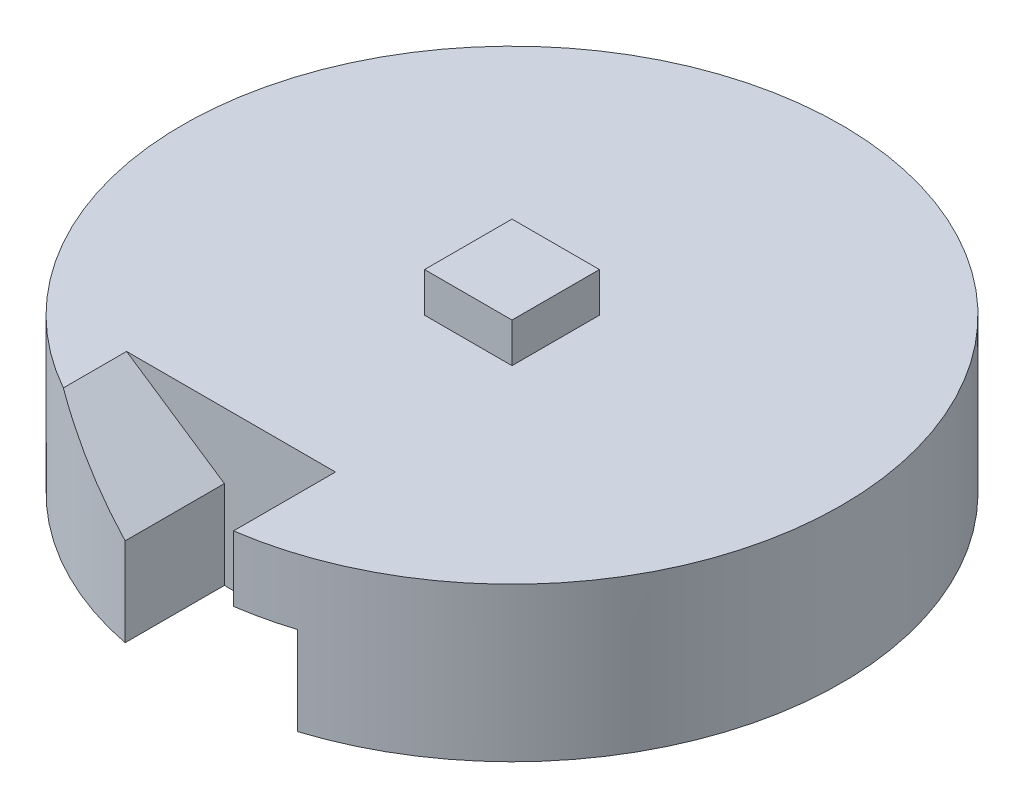
ISO-10303-21;
HEADER;
FILE_DESCRIPTION(('STEP AP214'),'2;1');
FILE_NAME('part.step','',(''),(''),'','','');
FILE_SCHEMA(('AUTOMOTIVE_DESIGN { 1 0 10303 214 1 1 1 1 }'));
ENDSEC;
DATA;
#1=APPLICATION_CONTEXT('core data for automotive mechanical design processes');
#2=APPLICATION_PROTOCOL_DEFINITION('international standard','automotive_design',2000,#1);
#3=PRODUCT_CONTEXT('',#1,'mechanical');
#4=PRODUCT('Part','Part','',(#3));
#5=PRODUCT_RELATED_PRODUCT_CATEGORY('part','',(#4));
#6=PRODUCT_DEFINITION_FORMATION('','',#4);
#7=PRODUCT_DEFINITION_CONTEXT('part definition',#1,'design');
#8=PRODUCT_DEFINITION('design','',#6,#7);
#9=PRODUCT_DEFINITION_SHAPE('','',#8);
#10=(LENGTH_UNIT() NAMED_UNIT(*) SI_UNIT(.MILLI.,.METRE.));
#11=(NAMED_UNIT(*) PLANE_ANGLE_UNIT() SI_UNIT($,.RADIAN.));
#12=(NAMED_UNIT(*) SI_UNIT($,.STERADIAN.) SOLID_ANGLE_UNIT());
#13=UNCERTAINTY_MEASURE_WITH_UNIT(LENGTH_MEASURE(1.E-05),#10,'distance_accuracy_value','');
#14=(GEOMETRIC_REPRESENTATION_CONTEXT(3) GLOBAL_UNCERTAINTY_ASSIGNED_CONTEXT((#13)) GLOBAL_UNIT_ASSIGNED_CONTEXT((#10,
#11,#12)) REPRESENTATION_CONTEXT('',''));
#15=CARTESIAN_POINT('',(0.,0.,0.));
#16=DIRECTION('',(0.,0.,1.));
#17=DIRECTION('',(1.,0.,0.));
#18=AXIS2_PLACEMENT_3D('',#15,#16,#17);
#19=CARTESIAN_POINT('',(0.,17.5,0.));
#20=DIRECTION('',(0.,1.,0.));
#21=DIRECTION('',(0.,0.,1.));
#22=AXIS2_PLACEMENT_3D('',#19,#20,#21);
#23=PLANE('',#22);
#24=DIRECTION('',(0.,0.,-1.));
#25=VECTOR('',#24,1.);
#26=CARTESIAN_POINT('',(5.40916797594821,17.5,0.));
#27=LINE('',#26,#25);
#28=CARTESIAN_POINT('',(5.40916797594821,17.5,37.1078280394848));
#29=VERTEX_POINT('',#28);
#30=CARTESIAN_POINT('',(5.40916797594821,17.5,25.5));
#31=VERTEX_POINT('',#30);
#32=EDGE_CURVE('E326',#29,#31,#27,.T.);
#33=ORIENTED_EDGE('',*,*,#32,.F.);
#34=CARTESIAN_POINT('',(0.,17.5,0.));
#35=DIRECTION('',(0.,1.,0.));
#36=DIRECTION('',(0.,0.,1.));
#37=AXIS2_PLACEMENT_3D('',#34,#35,#36);
#38=CIRCLE('',#37,37.5);
#39=CARTESIAN_POINT('',(-18.3618136354973,17.5,32.6969998626061));
#40=VERTEX_POINT('',#39);
#41=EDGE_CURVE('E305',#29,#40,#38,.T.);
#42=ORIENTED_EDGE('',*,*,#41,.T.);
#43=DIRECTION('',(0.,0.,1.));
#44=VECTOR('',#43,1.);
#45=CARTESIAN_POINT('',(-18.3618136354973,17.5,0.));
#46=LINE('',#45,#44);
#47=CARTESIAN_POINT('',(-18.3618136354973,17.5,25.5));
#48=VERTEX_POINT('',#47);
#49=EDGE_CURVE('E323',#48,#40,#46,.T.);
#50=ORIENTED_EDGE('',*,*,#49,.F.);
#51=DIRECTION('',(1.,0.,0.));
#52=VECTOR('',#51,1.);
#53=CARTESIAN_POINT('',(0.,17.5,25.5));
#54=LINE('',#53,#52);
#55=EDGE_CURVE('E277',#48,#31,#54,.T.);
#56=ORIENTED_EDGE('',*,*,#55,.T.);
#57=EDGE_LOOP('',(#33,#42,#50,#56));
#58=FACE_BOUND('',#57,.T.);
#59=DIRECTION('',(1.,0.,0.));
#60=VECTOR('',#59,1.);
#61=CARTESIAN_POINT('',(0.,17.5,-4.975));
#62=LINE('',#61,#60);
#63=CARTESIAN_POINT('',(-4.975,17.5,-4.975));
#64=VERTEX_POINT('',#63);
#65=CARTESIAN_POINT('',(4.975,17.5,-4.975));
#66=VERTEX_POINT('',#65);
#67=EDGE_CURVE('E247',#64,#66,#62,.T.);
#68=ORIENTED_EDGE('',*,*,#67,.T.);
#69=DIRECTION('',(0.,0.,1.));
#70=VECTOR('',#69,1.);
#71=CARTESIAN_POINT('',(4.975,17.5,0.));
#72=LINE('',#71,#70);
#73=CARTESIAN_POINT('',(4.975,17.5,4.975));
#74=VERTEX_POINT('',#73);
#75=EDGE_CURVE('E251',#66,#74,#72,.T.);
#76=ORIENTED_EDGE('',*,*,#75,.T.);
#77=DIRECTION('',(-1.,0.,0.));
#78=VECTOR('',#77,1.);
#79=CARTESIAN_POINT('',(0.,17.5,4.975));
#80=LINE('',#79,#78);
#81=CARTESIAN_POINT('',(-4.975,17.5,4.975));
#82=VERTEX_POINT('',#81);
#83=EDGE_CURVE('E239',#74,#82,#80,.T.);
#84=ORIENTED_EDGE('',*,*,#83,.T.);
#85=DIRECTION('',(0.,0.,-1.));
#86=VECTOR('',#85,1.);
#87=CARTESIAN_POINT('',(-4.975,17.5,0.));
#88=LINE('',#87,#86);
#89=EDGE_CURVE('E243',#82,#64,#88,.T.);
#90=ORIENTED_EDGE('',*,*,#89,.T.);
#91=EDGE_LOOP('',(#68,#76,#84,#90));
#92=FACE_BOUND('',#91,.T.);
#93=ADVANCED_FACE('F45',(#58,#92),#23,.T.);
#94=CARTESIAN_POINT('',(0.,17.5,0.));
#95=DIRECTION('',(0.,-1.,0.));
#96=DIRECTION('',(0.,0.,-1.));
#97=AXIS2_PLACEMENT_3D('',#94,#95,#96);
#98=CYLINDRICAL_SURFACE('',#97,37.5);
#99=ORIENTED_EDGE('',*,*,#41,.F.);
#100=DIRECTION('',(0.,-1.,0.));
#101=VECTOR('',#100,1.);
#102=CARTESIAN_POINT('',(5.40916797594821,17.5,37.1078280394848));
#103=LINE('',#102,#101);
#104=CARTESIAN_POINT('',(5.40916797594821,10.0586939101936,37.1078280394848));
#105=VERTEX_POINT('',#104);
#106=EDGE_CURVE('E300',#29,#105,#103,.T.);
#107=ORIENTED_EDGE('',*,*,#106,.T.);
#108=CARTESIAN_POINT('',(0.,10.0586939101936,0.));
#109=DIRECTION('',(0.,1.,0.));
#110=DIRECTION('',(0.,0.,1.));
#111=AXIS2_PLACEMENT_3D('',#108,#109,#110);
#112=CIRCLE('',#111,37.5);
#113=CARTESIAN_POINT('',(11.3377548552186,10.0586939101936,35.7450040543146));
#114=VERTEX_POINT('',#113);
#115=EDGE_CURVE('E54',#105,#114,#112,.T.);
#116=ORIENTED_EDGE('',*,*,#115,.T.);
#117=DIRECTION('',(0.,-1.,0.));
#118=VECTOR('',#117,1.);
#119=CARTESIAN_POINT('',(11.3377548552186,17.5,35.7450040543146));
#120=LINE('',#119,#118);
#121=CARTESIAN_POINT('',(11.3377548552186,0.,35.7450040543146));
#122=VERTEX_POINT('',#121);
#123=EDGE_CURVE('E292',#114,#122,#120,.T.);
#124=ORIENTED_EDGE('',*,*,#123,.T.);
#125=CARTESIAN_POINT('',(0.,0.,0.));
#126=DIRECTION('',(0.,1.,0.));
#127=DIRECTION('',(0.,0.,1.));
#128=AXIS2_PLACEMENT_3D('',#125,#126,#127);
#129=CIRCLE('',#128,37.5);
#130=CARTESIAN_POINT('',(-7.23202995206033,0.,36.7960288994954));
#131=VERTEX_POINT('',#130);
#132=EDGE_CURVE('E304',#122,#131,#129,.T.);
#133=ORIENTED_EDGE('',*,*,#132,.T.);
#134=DIRECTION('',(0.,-1.,0.));
#135=VECTOR('',#134,1.);
#136=CARTESIAN_POINT('',(-7.23202995206033,17.5,36.7960288994954));
#137=LINE('',#136,#135);
#138=CARTESIAN_POINT('',(-7.23202995206033,10.0401319165543,36.7960288994954));
#139=VERTEX_POINT('',#138);
#140=EDGE_CURVE('E288',#131,#139,#137,.F.);
#141=ORIENTED_EDGE('',*,*,#140,.T.);
#142=CARTESIAN_POINT('',(0.,5.19277899825944,0.));
#143=DIRECTION('',(-0.556765929579434,-0.830669428629433,0.));
#144=DIRECTION('',(0.830669428629433,-0.556765929579434,0.));
#145=AXIS2_PLACEMENT_3D('',#142,#143,#144);
#146=ELLIPSE('',#145,45.1443121746677,37.5);
#147=EDGE_CURVE('E296',#139,#40,#146,.T.);
#148=ORIENTED_EDGE('',*,*,#147,.T.);
#149=EDGE_LOOP('',(#99,#107,#116,#124,#133,#141,#148));
#150=FACE_BOUND('',#149,.T.);
#151=ADVANCED_FACE('F47',(#150),#98,.T.);
#152=CARTESIAN_POINT('',(0.,0.,0.));
#153=DIRECTION('',(0.,1.,0.));
#154=DIRECTION('',(0.,0.,1.));
#155=AXIS2_PLACEMENT_3D('',#152,#153,#154);
#156=PLANE('',#155);
#157=CARTESIAN_POINT('',(30.0180115311504,0.,0.00676759727533624));
#158=DIRECTION('',(0.,-1.,0.));
#159=DIRECTION('',(0.,0.,-1.));
#160=AXIS2_PLACEMENT_3D('',#157,#158,#159);
#161=CIRCLE('',#160,3.025);
#162=CARTESIAN_POINT('',(30.0180115311504,0.,-3.01823240272466));
#163=VERTEX_POINT('',#162);
#164=EDGE_CURVE('E412',#163,#163,#161,.T.);
#165=ORIENTED_EDGE('',*,*,#164,.F.);
#166=EDGE_LOOP('',(#165));
#167=FACE_BOUND('',#166,.T.);
#168=CARTESIAN_POINT('',(-29.9819884688496,0.,0.00676759727533257));
#169=DIRECTION('',(0.,-1.,0.));
#170=DIRECTION('',(0.,0.,-1.));
#171=AXIS2_PLACEMENT_3D('',#168,#169,#170);
#172=CIRCLE('',#171,3.025);
#173=CARTESIAN_POINT('',(-29.9819884688496,0.,-3.01823240272467));
#174=VERTEX_POINT('',#173);
#175=EDGE_CURVE('E416',#174,#174,#172,.T.);
#176=ORIENTED_EDGE('',*,*,#175,.F.);
#177=EDGE_LOOP('',(#176));
#178=FACE_BOUND('',#177,.T.);
#179=CARTESIAN_POINT('',(0.,0.,0.));
#180=DIRECTION('',(0.,1.,0.));
#181=DIRECTION('',(0.,0.,1.));
#182=AXIS2_PLACEMENT_3D('',#179,#180,#181);
#183=CIRCLE('',#182,5.);
#184=CARTESIAN_POINT('',(0.,0.,5.));
#185=VERTEX_POINT('',#184);
#186=EDGE_CURVE('E11',#185,#185,#183,.F.);
#187=ORIENTED_EDGE('',*,*,#186,.F.);
#188=EDGE_LOOP('',(#187));
#189=FACE_BOUND('',#188,.T.);
#190=ORIENTED_EDGE('',*,*,#132,.F.);
#191=DIRECTION('',(0.,0.,-1.));
#192=VECTOR('',#191,1.);
#193=CARTESIAN_POINT('',(11.3377548552186,0.,0.));
#194=LINE('',#193,#192);
#195=CARTESIAN_POINT('',(11.3377548552186,0.,25.5));
#196=VERTEX_POINT('',#195);
#197=EDGE_CURVE('E319',#122,#196,#194,.T.);
#198=ORIENTED_EDGE('',*,*,#197,.T.);
#199=DIRECTION('',(1.,0.,0.));
#200=VECTOR('',#199,1.);
#201=CARTESIAN_POINT('',(0.,0.,25.5));
#202=LINE('',#201,#200);
#203=CARTESIAN_POINT('',(-7.23202995206033,0.,25.5));
#204=VERTEX_POINT('',#203);
#205=EDGE_CURVE('E309',#204,#196,#202,.T.);
#206=ORIENTED_EDGE('',*,*,#205,.F.);
#207=DIRECTION('',(0.,0.,1.));
#208=VECTOR('',#207,1.);
#209=CARTESIAN_POINT('',(-7.23202995206033,0.,0.));
#210=LINE('',#209,#208);
#211=EDGE_CURVE('E315',#204,#131,#210,.T.);
#212=ORIENTED_EDGE('',*,*,#211,.T.);
#213=EDGE_LOOP('',(#190,#198,#206,#212));
#214=FACE_BOUND('',#213,.T.);
#215=ADVANCED_FACE('F348',(#167,#178,#189,#214),#156,.F.);
#216=CARTESIAN_POINT('',(5.40916797594821,10.0586939101936,25.5));
#217=DIRECTION('',(0.,1.,0.));
#218=DIRECTION('',(0.,0.,1.));
#219=AXIS2_PLACEMENT_3D('',#216,#217,#218);
#220=PLANE('',#219);
#221=DIRECTION('',(0.,0.,1.));
#222=VECTOR('',#221,1.);
#223=CARTESIAN_POINT('',(5.40916797594821,10.0586939101936,25.5));
#224=LINE('',#223,#222);
#225=CARTESIAN_POINT('',(5.40916797594821,10.0586939101936,25.5));
#226=VERTEX_POINT('',#225);
#227=EDGE_CURVE('E273',#226,#105,#224,.T.);
#228=ORIENTED_EDGE('',*,*,#227,.F.);
#229=DIRECTION('',(-1.,0.,0.));
#230=VECTOR('',#229,1.);
#231=CARTESIAN_POINT('',(5.40916797594821,10.0586939101936,25.5));
#232=LINE('',#231,#230);
#233=CARTESIAN_POINT('',(11.3377548552186,10.0586939101936,25.5));
#234=VERTEX_POINT('',#233);
#235=EDGE_CURVE('E268',#234,#226,#232,.T.);
#236=ORIENTED_EDGE('',*,*,#235,.F.);
#237=DIRECTION('',(0.,0.,1.));
#238=VECTOR('',#237,1.);
#239=CARTESIAN_POINT('',(11.3377548552186,10.0586939101936,25.5));
#240=LINE('',#239,#238);
#241=EDGE_CURVE('E278',#234,#114,#240,.T.);
#242=ORIENTED_EDGE('',*,*,#241,.T.);
#243=ORIENTED_EDGE('',*,*,#115,.F.);
#244=EDGE_LOOP('',(#228,#236,#242,#243));
#245=FACE_BOUND('',#244,.T.);
#246=ADVANCED_FACE('F334',(#245),#220,.F.);
#247=CARTESIAN_POINT('',(5.40916797594821,17.669921882635,25.5));
#248=DIRECTION('',(1.,0.,0.));
#249=DIRECTION('',(0.,1.,0.));
#250=AXIS2_PLACEMENT_3D('',#247,#248,#249);
#251=PLANE('',#250);
#252=ORIENTED_EDGE('',*,*,#32,.T.);
#253=DIRECTION('',(0.,1.,0.));
#254=VECTOR('',#253,1.);
#255=CARTESIAN_POINT('',(5.40916797594821,17.669921882635,25.5));
#256=LINE('',#255,#254);
#257=EDGE_CURVE('E255',#226,#31,#256,.T.);
#258=ORIENTED_EDGE('',*,*,#257,.F.);
#259=ORIENTED_EDGE('',*,*,#227,.T.);
#260=ORIENTED_EDGE('',*,*,#106,.F.);
#261=EDGE_LOOP('',(#252,#258,#259,#260));
#262=FACE_BOUND('',#261,.T.);
#263=ADVANCED_FACE('F339',(#262),#251,.F.);
#264=CARTESIAN_POINT('',(-18.6153293512788,17.669921882635,25.5));
#265=DIRECTION('',(-0.556765929579434,-0.830669428629433,0.));
#266=DIRECTION('',(0.830669428629433,-0.556765929579434,0.));
#267=AXIS2_PLACEMENT_3D('',#264,#265,#266);
#268=PLANE('',#267);
#269=DIRECTION('',(0.,0.,1.));
#270=VECTOR('',#269,1.);
#271=CARTESIAN_POINT('',(-7.23202995206033,10.0401319165543,25.5));
#272=LINE('',#271,#270);
#273=CARTESIAN_POINT('',(-7.23202995206033,10.0401319165543,25.5));
#274=VERTEX_POINT('',#273);
#275=EDGE_CURVE('E272',#274,#139,#272,.T.);
#276=ORIENTED_EDGE('',*,*,#275,.F.);
#277=DIRECTION('',(0.830669428629433,-0.556765929579434,0.));
#278=VECTOR('',#277,1.);
#279=CARTESIAN_POINT('',(-18.6153293512788,17.669921882635,25.5));
#280=LINE('',#279,#278);
#281=EDGE_CURVE('E259',#48,#274,#280,.T.);
#282=ORIENTED_EDGE('',*,*,#281,.F.);
#283=ORIENTED_EDGE('',*,*,#49,.T.);
#284=ORIENTED_EDGE('',*,*,#147,.F.);
#285=EDGE_LOOP('',(#276,#282,#283,#284));
#286=FACE_BOUND('',#285,.T.);
#287=ADVANCED_FACE('F356',(#286),#268,.F.);
#288=CARTESIAN_POINT('',(11.3377548552186,10.0586939101936,25.5));
#289=DIRECTION('',(1.,0.,0.));
#290=DIRECTION('',(0.,1.,0.));
#291=AXIS2_PLACEMENT_3D('',#288,#289,#290);
#292=PLANE('',#291);
#293=ORIENTED_EDGE('',*,*,#241,.F.);
#294=DIRECTION('',(0.,1.,0.));
#295=VECTOR('',#294,1.);
#296=CARTESIAN_POINT('',(11.3377548552186,10.0586939101936,25.5));
#297=LINE('',#296,#295);
#298=EDGE_CURVE('E265',#196,#234,#297,.T.);
#299=ORIENTED_EDGE('',*,*,#298,.F.);
#300=ORIENTED_EDGE('',*,*,#197,.F.);
#301=ORIENTED_EDGE('',*,*,#123,.F.);
#302=EDGE_LOOP('',(#293,#299,#300,#301));
#303=FACE_BOUND('',#302,.T.);
#304=ADVANCED_FACE('F346',(#303),#292,.F.);
#305=CARTESIAN_POINT('',(-7.23202995206033,10.0401319165543,25.5));
#306=DIRECTION('',(-1.,0.,0.));
#307=DIRECTION('',(0.,0.,1.));
#308=AXIS2_PLACEMENT_3D('',#305,#306,#307);
#309=PLANE('',#308);
#310=ORIENTED_EDGE('',*,*,#211,.F.);
#311=DIRECTION('',(0.,-1.,0.));
#312=VECTOR('',#311,1.);
#313=CARTESIAN_POINT('',(-7.23202995206033,10.0401319165543,25.5));
#314=LINE('',#313,#312);
#315=EDGE_CURVE('E262',#274,#204,#314,.T.);
#316=ORIENTED_EDGE('',*,*,#315,.F.);
#317=ORIENTED_EDGE('',*,*,#275,.T.);
#318=ORIENTED_EDGE('',*,*,#140,.F.);
#319=EDGE_LOOP('',(#310,#316,#317,#318));
#320=FACE_BOUND('',#319,.T.);
#321=ADVANCED_FACE('F351',(#320),#309,.F.);
#322=CARTESIAN_POINT('',(0.,0.,25.5));
#323=DIRECTION('',(0.,0.,1.));
#324=DIRECTION('',(1.,0.,0.));
#325=AXIS2_PLACEMENT_3D('',#322,#323,#324);
#326=PLANE('',#325);
#327=ORIENTED_EDGE('',*,*,#281,.T.);
#328=ORIENTED_EDGE('',*,*,#315,.T.);
#329=ORIENTED_EDGE('',*,*,#205,.T.);
#330=ORIENTED_EDGE('',*,*,#298,.T.);
#331=ORIENTED_EDGE('',*,*,#235,.T.);
#332=ORIENTED_EDGE('',*,*,#257,.T.);
#333=ORIENTED_EDGE('',*,*,#55,.F.);
#334=EDGE_LOOP('',(#327,#328,#329,#330,#331,#332,#333));
#335=FACE_BOUND('',#334,.T.);
#336=ADVANCED_FACE('F342',(#335),#326,.T.);
#337=CARTESIAN_POINT('',(4.975,22.,-4.975));
#338=DIRECTION('',(-1.,0.,0.));
#339=DIRECTION('',(0.,0.,1.));
#340=AXIS2_PLACEMENT_3D('',#337,#338,#339);
#341=PLANE('',#340);
#342=ORIENTED_EDGE('',*,*,#75,.F.);
#343=DIRECTION('',(0.,-1.,0.));
#344=VECTOR('',#343,1.);
#345=CARTESIAN_POINT('',(4.975,22.,-4.975));
#346=LINE('',#345,#344);
#347=CARTESIAN_POINT('',(4.975,22.,-4.975));
#348=VERTEX_POINT('',#347);
#349=EDGE_CURVE('E235',#348,#66,#346,.T.);
#350=ORIENTED_EDGE('',*,*,#349,.F.);
#351=DIRECTION('',(0.,0.,-1.));
#352=VECTOR('',#351,1.);
#353=CARTESIAN_POINT('',(4.975,22.,-4.975));
#354=LINE('',#353,#352);
#355=CARTESIAN_POINT('',(4.975,22.,4.975));
#356=VERTEX_POINT('',#355);
#357=EDGE_CURVE('E212',#356,#348,#354,.T.);
#358=ORIENTED_EDGE('',*,*,#357,.F.);
#359=DIRECTION('',(0.,-1.,0.));
#360=VECTOR('',#359,1.);
#361=CARTESIAN_POINT('',(4.975,22.,4.975));
#362=LINE('',#361,#360);
#363=EDGE_CURVE('E225',#356,#74,#362,.T.);
#364=ORIENTED_EDGE('',*,*,#363,.T.);
#365=EDGE_LOOP('',(#342,#350,#358,#364));
#366=FACE_BOUND('',#365,.T.);
#367=ADVANCED_FACE('F374',(#366),#341,.F.);
#368=CARTESIAN_POINT('',(-4.975,22.,-4.975));
#369=DIRECTION('',(0.,0.,1.));
#370=DIRECTION('',(1.,0.,0.));
#371=AXIS2_PLACEMENT_3D('',#368,#369,#370);
#372=PLANE('',#371);
#373=ORIENTED_EDGE('',*,*,#67,.F.);
#374=DIRECTION('',(0.,-1.,0.));
#375=VECTOR('',#374,1.);
#376=CARTESIAN_POINT('',(-4.975,22.,-4.975));
#377=LINE('',#376,#375);
#378=CARTESIAN_POINT('',(-4.975,22.,-4.975));
#379=VERTEX_POINT('',#378);
#380=EDGE_CURVE('E231',#379,#64,#377,.T.);
#381=ORIENTED_EDGE('',*,*,#380,.F.);
#382=DIRECTION('',(-1.,0.,0.));
#383=VECTOR('',#382,1.);
#384=CARTESIAN_POINT('',(-4.975,22.,-4.975));
#385=LINE('',#384,#383);
#386=EDGE_CURVE('E216',#348,#379,#385,.T.);
#387=ORIENTED_EDGE('',*,*,#386,.F.);
#388=ORIENTED_EDGE('',*,*,#349,.T.);
#389=EDGE_LOOP('',(#373,#381,#387,#388));
#390=FACE_BOUND('',#389,.T.);
#391=ADVANCED_FACE('F364',(#390),#372,.F.);
#392=CARTESIAN_POINT('',(-4.975,22.,-4.975));
#393=DIRECTION('',(1.,0.,0.));
#394=DIRECTION('',(0.,0.,-1.));
#395=AXIS2_PLACEMENT_3D('',#392,#393,#394);
#396=PLANE('',#395);
#397=ORIENTED_EDGE('',*,*,#89,.F.);
#398=DIRECTION('',(0.,-1.,0.));
#399=VECTOR('',#398,1.);
#400=CARTESIAN_POINT('',(-4.975,22.,4.975));
#401=LINE('',#400,#399);
#402=CARTESIAN_POINT('',(-4.975,22.,4.975));
#403=VERTEX_POINT('',#402);
#404=EDGE_CURVE('E69',#403,#82,#401,.T.);
#405=ORIENTED_EDGE('',*,*,#404,.F.);
#406=DIRECTION('',(0.,0.,1.));
#407=VECTOR('',#406,1.);
#408=CARTESIAN_POINT('',(-4.975,22.,-4.975));
#409=LINE('',#408,#407);
#410=EDGE_CURVE('E219',#379,#403,#409,.T.);
#411=ORIENTED_EDGE('',*,*,#410,.F.);
#412=ORIENTED_EDGE('',*,*,#380,.T.);
#413=EDGE_LOOP('',(#397,#405,#411,#412));
#414=FACE_BOUND('',#413,.T.);
#415=ADVANCED_FACE('F368',(#414),#396,.F.);
#416=CARTESIAN_POINT('',(-4.975,22.,4.975));
#417=DIRECTION('',(0.,0.,-1.));
#418=DIRECTION('',(-1.,0.,0.));
#419=AXIS2_PLACEMENT_3D('',#416,#417,#418);
#420=PLANE('',#419);
#421=ORIENTED_EDGE('',*,*,#83,.F.);
#422=ORIENTED_EDGE('',*,*,#363,.F.);
#423=DIRECTION('',(1.,0.,0.));
#424=VECTOR('',#423,1.);
#425=CARTESIAN_POINT('',(-4.975,22.,4.975));
#426=LINE('',#425,#424);
#427=EDGE_CURVE('E222',#403,#356,#426,.T.);
#428=ORIENTED_EDGE('',*,*,#427,.F.);
#429=ORIENTED_EDGE('',*,*,#404,.T.);
#430=EDGE_LOOP('',(#421,#422,#428,#429));
#431=FACE_BOUND('',#430,.T.);
#432=ADVANCED_FACE('F375',(#431),#420,.F.);
#433=CARTESIAN_POINT('',(0.,22.,0.));
#434=DIRECTION('',(0.,1.,0.));
#435=DIRECTION('',(0.,0.,1.));
#436=AXIS2_PLACEMENT_3D('',#433,#434,#435);
#437=PLANE('',#436);
#438=ORIENTED_EDGE('',*,*,#357,.T.);
#439=ORIENTED_EDGE('',*,*,#386,.T.);
#440=ORIENTED_EDGE('',*,*,#410,.T.);
#441=ORIENTED_EDGE('',*,*,#427,.T.);
#442=EDGE_LOOP('',(#438,#439,#440,#441));
#443=FACE_BOUND('',#442,.T.);
#444=ADVANCED_FACE('F370',(#443),#437,.T.);
#445=CARTESIAN_POINT('',(0.,-5.,0.));
#446=DIRECTION('',(0.,1.,0.));
#447=DIRECTION('',(0.,0.,1.));
#448=AXIS2_PLACEMENT_3D('',#445,#446,#447);
#449=CYLINDRICAL_SURFACE('',#448,5.);
#450=CARTESIAN_POINT('',(0.,-5.,0.));
#451=DIRECTION('',(0.,-1.,0.));
#452=DIRECTION('',(0.,0.,-1.));
#453=AXIS2_PLACEMENT_3D('',#450,#451,#452);
#454=CIRCLE('',#453,5.);
#455=CARTESIAN_POINT('',(0.,-5.,-5.));
#456=VERTEX_POINT('',#455);
#457=EDGE_CURVE('E203',#456,#456,#454,.T.);
#458=ORIENTED_EDGE('',*,*,#457,.F.);
#459=EDGE_LOOP('',(#458));
#460=FACE_BOUND('',#459,.T.);
#461=ORIENTED_EDGE('',*,*,#186,.T.);
#462=EDGE_LOOP('',(#461));
#463=FACE_BOUND('',#462,.T.);
#464=ADVANCED_FACE('F382',(#460,#463),#449,.T.);
#465=CARTESIAN_POINT('',(0.,-5.,0.));
#466=DIRECTION('',(0.,-1.,0.));
#467=DIRECTION('',(0.,0.,-1.));
#468=AXIS2_PLACEMENT_3D('',#465,#466,#467);
#469=PLANE('',#468);
#470=DIRECTION('',(0.,0.,1.));
#471=VECTOR('',#470,1.);
#472=CARTESIAN_POINT('',(2.53459289985249,-5.,-1.51611762881908));
#473=LINE('',#472,#471);
#474=CARTESIAN_POINT('',(2.53459289985249,-5.,-1.51611762881908));
#475=VERTEX_POINT('',#474);
#476=CARTESIAN_POINT('',(2.53459289985249,-5.,1.48388237118092));
#477=VERTEX_POINT('',#476);
#478=EDGE_CURVE('E61',#475,#477,#473,.T.);
#479=ORIENTED_EDGE('',*,*,#478,.F.);
#480=DIRECTION('',(1.,0.,0.));
#481=VECTOR('',#480,1.);
#482=CARTESIAN_POINT('',(-2.46540710014751,-5.,-1.51611762881908));
#483=LINE('',#482,#481);
#484=CARTESIAN_POINT('',(-2.46540710014751,-5.,-1.51611762881908));
#485=VERTEX_POINT('',#484);
#486=EDGE_CURVE('E194',#485,#475,#483,.T.);
#487=ORIENTED_EDGE('',*,*,#486,.F.);
#488=DIRECTION('',(0.,0.,-1.));
#489=VECTOR('',#488,1.);
#490=CARTESIAN_POINT('',(-2.46540710014751,-5.,1.48388237118092));
#491=LINE('',#490,#489);
#492=CARTESIAN_POINT('',(-2.46540710014751,-5.,1.48388237118092));
#493=VERTEX_POINT('',#492);
#494=EDGE_CURVE('E190',#493,#485,#491,.T.);
#495=ORIENTED_EDGE('',*,*,#494,.F.);
#496=DIRECTION('',(-1.,0.,0.));
#497=VECTOR('',#496,1.);
#498=CARTESIAN_POINT('',(0.0345928998524907,-5.,1.48388237118092));
#499=LINE('',#498,#497);
#500=EDGE_CURVE('E170',#477,#493,#499,.T.);
#501=ORIENTED_EDGE('',*,*,#500,.F.);
#502=EDGE_LOOP('',(#479,#487,#495,#501));
#503=FACE_BOUND('',#502,.T.);
#504=ORIENTED_EDGE('',*,*,#457,.T.);
#505=EDGE_LOOP('',(#504));
#506=FACE_BOUND('',#505,.T.);
#507=ADVANCED_FACE('F420',(#503,#506),#469,.T.);
#508=CARTESIAN_POINT('',(2.53459289985249,5.,-1.51611762881908));
#509=DIRECTION('',(1.,0.,0.));
#510=DIRECTION('',(0.,0.,-1.));
#511=AXIS2_PLACEMENT_3D('',#508,#509,#510);
#512=PLANE('',#511);
#513=ORIENTED_EDGE('',*,*,#478,.T.);
#514=DIRECTION('',(0.,-1.,0.));
#515=VECTOR('',#514,1.);
#516=CARTESIAN_POINT('',(2.53459289985249,5.,1.48388237118092));
#517=LINE('',#516,#515);
#518=CARTESIAN_POINT('',(2.53459289985249,5.,1.48388237118092));
#519=VERTEX_POINT('',#518);
#520=EDGE_CURVE('E200',#519,#477,#517,.T.);
#521=ORIENTED_EDGE('',*,*,#520,.F.);
#522=DIRECTION('',(0.,0.,1.));
#523=VECTOR('',#522,1.);
#524=CARTESIAN_POINT('',(2.53459289985249,5.,-1.51611762881908));
#525=LINE('',#524,#523);
#526=CARTESIAN_POINT('',(2.53459289985249,5.,-1.51611762881908));
#527=VERTEX_POINT('',#526);
#528=EDGE_CURVE('E162',#527,#519,#525,.T.);
#529=ORIENTED_EDGE('',*,*,#528,.F.);
#530=DIRECTION('',(0.,-1.,0.));
#531=VECTOR('',#530,1.);
#532=CARTESIAN_POINT('',(2.53459289985249,5.,-1.51611762881908));
#533=LINE('',#532,#531);
#534=EDGE_CURVE('E204',#527,#475,#533,.T.);
#535=ORIENTED_EDGE('',*,*,#534,.T.);
#536=EDGE_LOOP('',(#513,#521,#529,#535));
#537=FACE_BOUND('',#536,.T.);
#538=ADVANCED_FACE('F425',(#537),#512,.F.);
#539=CARTESIAN_POINT('',(-2.46540710014751,5.,-1.51611762881908));
#540=DIRECTION('',(0.,0.,-1.));
#541=DIRECTION('',(-1.,0.,0.));
#542=AXIS2_PLACEMENT_3D('',#539,#540,#541);
#543=PLANE('',#542);
#544=ORIENTED_EDGE('',*,*,#486,.T.);
#545=ORIENTED_EDGE('',*,*,#534,.F.);
#546=DIRECTION('',(1.,0.,0.));
#547=VECTOR('',#546,1.);
#548=CARTESIAN_POINT('',(-2.46540710014751,5.,-1.51611762881908));
#549=LINE('',#548,#547);
#550=CARTESIAN_POINT('',(-2.46540710014751,5.,-1.51611762881908));
#551=VERTEX_POINT('',#550);
#552=EDGE_CURVE('E180',#551,#527,#549,.T.);
#553=ORIENTED_EDGE('',*,*,#552,.F.);
#554=DIRECTION('',(0.,-1.,0.));
#555=VECTOR('',#554,1.);
#556=CARTESIAN_POINT('',(-2.46540710014751,5.,-1.51611762881908));
#557=LINE('',#556,#555);
#558=EDGE_CURVE('E175',#551,#485,#557,.T.);
#559=ORIENTED_EDGE('',*,*,#558,.T.);
#560=EDGE_LOOP('',(#544,#545,#553,#559));
#561=FACE_BOUND('',#560,.T.);
#562=ADVANCED_FACE('F434',(#561),#543,.F.);
#563=CARTESIAN_POINT('',(-2.46540710014751,5.,1.48388237118092));
#564=DIRECTION('',(-1.,0.,0.));
#565=DIRECTION('',(0.,0.,1.));
#566=AXIS2_PLACEMENT_3D('',#563,#564,#565);
#567=PLANE('',#566);
#568=ORIENTED_EDGE('',*,*,#494,.T.);
#569=ORIENTED_EDGE('',*,*,#558,.F.);
#570=DIRECTION('',(0.,0.,-1.));
#571=VECTOR('',#570,1.);
#572=CARTESIAN_POINT('',(-2.46540710014751,5.,1.48388237118092));
#573=LINE('',#572,#571);
#574=CARTESIAN_POINT('',(-2.46540710014751,5.,1.48388237118092));
#575=VERTEX_POINT('',#574);
#576=EDGE_CURVE('E160',#575,#551,#573,.T.);
#577=ORIENTED_EDGE('',*,*,#576,.F.);
#578=DIRECTION('',(0.,-1.,0.));
#579=VECTOR('',#578,1.);
#580=CARTESIAN_POINT('',(-2.46540710014751,5.,1.48388237118092));
#581=LINE('',#580,#579);
#582=EDGE_CURVE('E167',#575,#493,#581,.T.);
#583=ORIENTED_EDGE('',*,*,#582,.T.);
#584=EDGE_LOOP('',(#568,#569,#577,#583));
#585=FACE_BOUND('',#584,.T.);
#586=ADVANCED_FACE('F177',(#585),#567,.F.);
#587=CARTESIAN_POINT('',(0.0345928998524907,5.,1.48388237118092));
#588=DIRECTION('',(0.,0.,1.));
#589=DIRECTION('',(1.,0.,0.));
#590=AXIS2_PLACEMENT_3D('',#587,#588,#589);
#591=PLANE('',#590);
#592=ORIENTED_EDGE('',*,*,#500,.T.);
#593=ORIENTED_EDGE('',*,*,#582,.F.);
#594=DIRECTION('',(-1.,0.,0.));
#595=VECTOR('',#594,1.);
#596=CARTESIAN_POINT('',(2.53459289985249,5.,1.48388237118092));
#597=LINE('',#596,#595);
#598=EDGE_CURVE('E155',#519,#575,#597,.T.);
#599=ORIENTED_EDGE('',*,*,#598,.F.);
#600=ORIENTED_EDGE('',*,*,#520,.T.);
#601=EDGE_LOOP('',(#592,#593,#599,#600));
#602=FACE_BOUND('',#601,.T.);
#603=ADVANCED_FACE('F168',(#602),#591,.F.);
#604=CARTESIAN_POINT('',(0.,5.,0.));
#605=DIRECTION('',(0.,-1.,0.));
#606=DIRECTION('',(0.,0.,-1.));
#607=AXIS2_PLACEMENT_3D('',#604,#605,#606);
#608=PLANE('',#607);
#609=ORIENTED_EDGE('',*,*,#598,.T.);
#610=ORIENTED_EDGE('',*,*,#576,.T.);
#611=ORIENTED_EDGE('',*,*,#552,.T.);
#612=ORIENTED_EDGE('',*,*,#528,.T.);
#613=EDGE_LOOP('',(#609,#610,#611,#612));
#614=FACE_BOUND('',#613,.T.);
#615=ADVANCED_FACE('F157',(#614),#608,.T.);
#616=CARTESIAN_POINT('',(-29.9819884688496,1.6,0.00676759727533257));
#617=DIRECTION('',(0.,-1.,0.));
#618=DIRECTION('',(0.,0.,-1.));
#619=AXIS2_PLACEMENT_3D('',#616,#617,#618);
#620=CYLINDRICAL_SURFACE('',#619,3.025);
#621=CARTESIAN_POINT('',(-29.9819884688496,1.6,0.00676759727533257));
#622=DIRECTION('',(0.,-1.,0.));
#623=DIRECTION('',(0.,0.,-1.));
#624=AXIS2_PLACEMENT_3D('',#621,#622,#623);
#625=CIRCLE('',#624,3.025);
#626=CARTESIAN_POINT('',(-29.9819884688496,1.6,-3.01823240272467));
#627=VERTEX_POINT('',#626);
#628=EDGE_CURVE('E465',#627,#627,#625,.T.);
#629=ORIENTED_EDGE('',*,*,#628,.F.);
#630=EDGE_LOOP('',(#629));
#631=FACE_BOUND('',#630,.T.);
#632=ORIENTED_EDGE('',*,*,#175,.T.);
#633=EDGE_LOOP('',(#632));
#634=FACE_BOUND('',#633,.T.);
#635=ADVANCED_FACE('F441',(#631,#634),#620,.F.);
#636=CARTESIAN_POINT('',(-29.9819884688496,1.6,0.00676759727533257));
#637=DIRECTION('',(0.,-1.,0.));
#638=DIRECTION('',(0.,0.,-1.));
#639=AXIS2_PLACEMENT_3D('',#636,#637,#638);
#640=PLANE('',#639);
#641=ORIENTED_EDGE('',*,*,#628,.T.);
#642=EDGE_LOOP('',(#641));
#643=FACE_BOUND('',#642,.T.);
#644=ADVANCED_FACE('F442',(#643),#640,.T.);
#645=CARTESIAN_POINT('',(30.0180115311504,1.6,0.00676759727533624));
#646=DIRECTION('',(0.,-1.,0.));
#647=DIRECTION('',(0.,0.,-1.));
#648=AXIS2_PLACEMENT_3D('',#645,#646,#647);
#649=CYLINDRICAL_SURFACE('',#648,3.025);
#650=CARTESIAN_POINT('',(30.0180115311504,1.6,0.00676759727533624));
#651=DIRECTION('',(0.,-1.,0.));
#652=DIRECTION('',(0.,0.,-1.));
#653=AXIS2_PLACEMENT_3D('',#650,#651,#652);
#654=CIRCLE('',#653,3.025);
#655=CARTESIAN_POINT('',(30.0180115311504,1.6,-3.01823240272466));
#656=VERTEX_POINT('',#655);
#657=EDGE_CURVE('E191',#656,#656,#654,.T.);
#658=ORIENTED_EDGE('',*,*,#657,.F.);
#659=EDGE_LOOP('',(#658));
#660=FACE_BOUND('',#659,.T.);
#661=ORIENTED_EDGE('',*,*,#164,.T.);
#662=EDGE_LOOP('',(#661));
#663=FACE_BOUND('',#662,.T.);
#664=ADVANCED_FACE('F445',(#660,#663),#649,.F.);
#665=CARTESIAN_POINT('',(30.0180115311504,1.6,0.00676759727533624));
#666=DIRECTION('',(0.,-1.,0.));
#667=DIRECTION('',(0.,0.,-1.));
#668=AXIS2_PLACEMENT_3D('',#665,#666,#667);
#669=PLANE('',#668);
#670=ORIENTED_EDGE('',*,*,#657,.T.);
#671=EDGE_LOOP('',(#670));
#672=FACE_BOUND('',#671,.T.);
#673=ADVANCED_FACE('F451',(#672),#669,.T.);
#674=CLOSED_SHELL('',(#93,#151,#215,#246,#263,#287,#304,#321,#336,#367,#391,#415,#432,#444,#464,
#507,#538,#562,#586,#603,#615,#635,#644,#664,#673));
#675=MANIFOLD_SOLID_BREP('B2',#674);
#676=ADVANCED_BREP_SHAPE_REPRESENTATION('',(#18,#675),#14);
#677=SHAPE_DEFINITION_REPRESENTATION(#9,#676);
ENDSEC;
END-ISO-10303-21;
